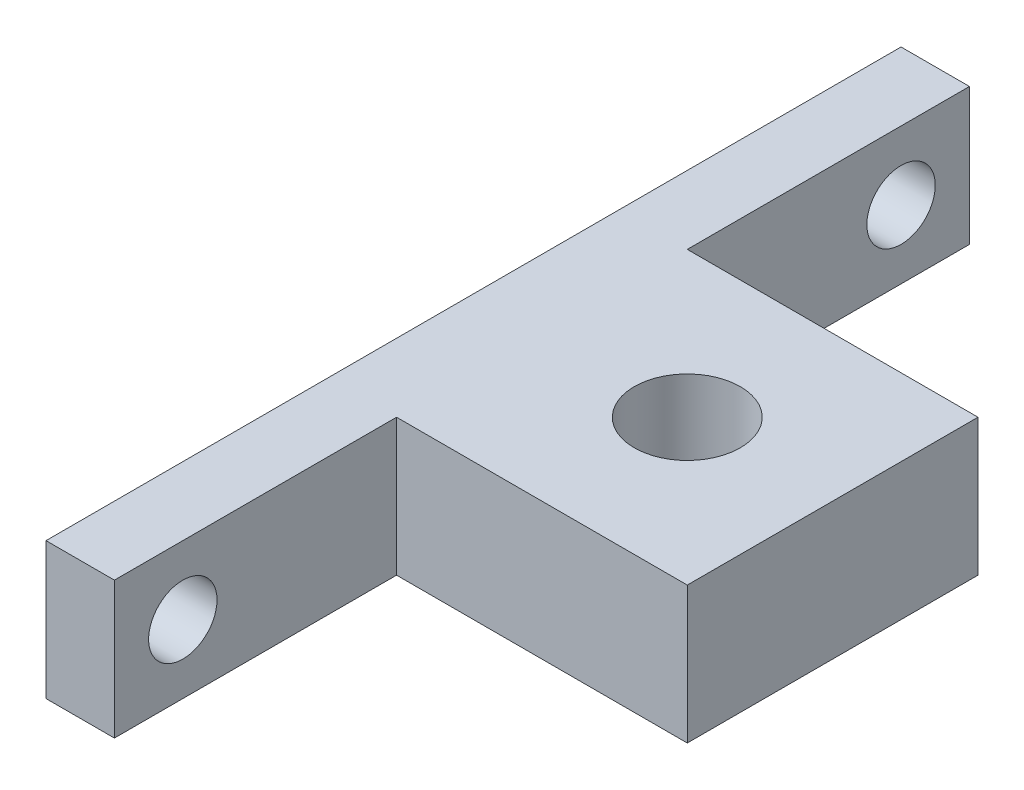
ISO-10303-21;
HEADER;
FILE_DESCRIPTION(('STEP AP214'),'2;1');
FILE_NAME('part.step','',(''),(''),'','','');
FILE_SCHEMA(('AUTOMOTIVE_DESIGN { 1 0 10303 214 1 1 1 1 }'));
ENDSEC;
DATA;
#1=APPLICATION_CONTEXT('core data for automotive mechanical design processes');
#2=APPLICATION_PROTOCOL_DEFINITION('international standard','automotive_design',2000,#1);
#3=PRODUCT_CONTEXT('',#1,'mechanical');
#4=PRODUCT('Part','Part','',(#3));
#5=PRODUCT_RELATED_PRODUCT_CATEGORY('part','',(#4));
#6=PRODUCT_DEFINITION_FORMATION('','',#4);
#7=PRODUCT_DEFINITION_CONTEXT('part definition',#1,'design');
#8=PRODUCT_DEFINITION('design','',#6,#7);
#9=PRODUCT_DEFINITION_SHAPE('','',#8);
#10=(LENGTH_UNIT() NAMED_UNIT(*) SI_UNIT(.MILLI.,.METRE.));
#11=(NAMED_UNIT(*) PLANE_ANGLE_UNIT() SI_UNIT($,.RADIAN.));
#12=(NAMED_UNIT(*) SI_UNIT($,.STERADIAN.) SOLID_ANGLE_UNIT());
#13=UNCERTAINTY_MEASURE_WITH_UNIT(LENGTH_MEASURE(1.E-05),#10,'distance_accuracy_value','');
#14=(GEOMETRIC_REPRESENTATION_CONTEXT(3) GLOBAL_UNCERTAINTY_ASSIGNED_CONTEXT((#13)) GLOBAL_UNIT_ASSIGNED_CONTEXT((#10,
#11,#12)) REPRESENTATION_CONTEXT('',''));
#15=CARTESIAN_POINT('',(0.,0.,0.));
#16=DIRECTION('',(0.,0.,1.));
#17=DIRECTION('',(1.,0.,0.));
#18=AXIS2_PLACEMENT_3D('',#15,#16,#17);
#19=CARTESIAN_POINT('',(4.,0.,0.));
#20=DIRECTION('',(-1.,0.,0.));
#21=DIRECTION('',(0.,0.,1.));
#22=AXIS2_PLACEMENT_3D('',#19,#20,#21);
#23=PLANE('',#22);
#24=CARTESIAN_POINT('',(4.,0.,21.));
#25=DIRECTION('',(1.,0.,0.));
#26=DIRECTION('',(0.,0.,-1.));
#27=AXIS2_PLACEMENT_3D('',#24,#25,#26);
#28=CIRCLE('',#27,2.);
#29=CARTESIAN_POINT('',(4.,0.,19.));
#30=VERTEX_POINT('',#29);
#31=EDGE_CURVE('E145',#30,#30,#28,.T.);
#32=ORIENTED_EDGE('',*,*,#31,.F.);
#33=EDGE_LOOP('',(#32));
#34=FACE_BOUND('',#33,.T.);
#35=DIRECTION('',(0.,-1.,0.));
#36=VECTOR('',#35,1.);
#37=CARTESIAN_POINT('',(4.,-4.00000000000001,8.5));
#38=LINE('',#37,#36);
#39=CARTESIAN_POINT('',(4.,4.,8.5));
#40=VERTEX_POINT('',#39);
#41=CARTESIAN_POINT('',(4.,-4.00000000000001,8.5));
#42=VERTEX_POINT('',#41);
#43=EDGE_CURVE('E128',#40,#42,#38,.T.);
#44=ORIENTED_EDGE('',*,*,#43,.F.);
#45=DIRECTION('',(0.,0.,1.));
#46=VECTOR('',#45,1.);
#47=CARTESIAN_POINT('',(4.,3.99999999999999,25.));
#48=LINE('',#47,#46);
#49=CARTESIAN_POINT('',(4.,3.99999999999999,25.));
#50=VERTEX_POINT('',#49);
#51=EDGE_CURVE('E157',#40,#50,#48,.T.);
#52=ORIENTED_EDGE('',*,*,#51,.T.);
#53=DIRECTION('',(0.,-1.,0.));
#54=VECTOR('',#53,1.);
#55=CARTESIAN_POINT('',(4.,-4.00000000000001,25.));
#56=LINE('',#55,#54);
#57=CARTESIAN_POINT('',(4.,-4.00000000000001,25.));
#58=VERTEX_POINT('',#57);
#59=EDGE_CURVE('E162',#50,#58,#56,.T.);
#60=ORIENTED_EDGE('',*,*,#59,.T.);
#61=DIRECTION('',(0.,0.,-1.));
#62=VECTOR('',#61,1.);
#63=CARTESIAN_POINT('',(4.,-4.00000000000001,25.));
#64=LINE('',#63,#62);
#65=EDGE_CURVE('E63',#58,#42,#64,.T.);
#66=ORIENTED_EDGE('',*,*,#65,.T.);
#67=EDGE_LOOP('',(#44,#52,#60,#66));
#68=FACE_BOUND('',#67,.T.);
#69=ADVANCED_FACE('F39',(#34,#68),#23,.F.);
#70=CARTESIAN_POINT('',(4.,0.,-21.));
#71=DIRECTION('',(1.,0.,0.));
#72=DIRECTION('',(0.,0.,1.));
#73=AXIS2_PLACEMENT_3D('',#70,#71,#72);
#74=CIRCLE('',#73,2.);
#75=CARTESIAN_POINT('',(4.,0.,-19.));
#76=VERTEX_POINT('',#75);
#77=EDGE_CURVE('E135',#76,#76,#74,.T.);
#78=ORIENTED_EDGE('',*,*,#77,.F.);
#79=EDGE_LOOP('',(#78));
#80=FACE_BOUND('',#79,.T.);
#81=DIRECTION('',(0.,1.,0.));
#82=VECTOR('',#81,1.);
#83=CARTESIAN_POINT('',(4.,-4.00000000000001,-8.5));
#84=LINE('',#83,#82);
#85=CARTESIAN_POINT('',(4.,-4.,-8.5));
#86=VERTEX_POINT('',#85);
#87=CARTESIAN_POINT('',(4.,4.00000000000001,-8.5));
#88=VERTEX_POINT('',#87);
#89=EDGE_CURVE('E55',#86,#88,#84,.T.);
#90=ORIENTED_EDGE('',*,*,#89,.F.);
#91=CARTESIAN_POINT('',(4.,-4.,-25.));
#92=VERTEX_POINT('',#91);
#93=EDGE_CURVE('E165',#86,#92,#64,.T.);
#94=ORIENTED_EDGE('',*,*,#93,.T.);
#95=DIRECTION('',(0.,1.,0.));
#96=VECTOR('',#95,1.);
#97=CARTESIAN_POINT('',(4.,-4.,-25.));
#98=LINE('',#97,#96);
#99=CARTESIAN_POINT('',(4.,4.00000000000001,-25.));
#100=VERTEX_POINT('',#99);
#101=EDGE_CURVE('E153',#92,#100,#98,.T.);
#102=ORIENTED_EDGE('',*,*,#101,.T.);
#103=EDGE_CURVE('E159',#100,#88,#48,.T.);
#104=ORIENTED_EDGE('',*,*,#103,.T.);
#105=EDGE_LOOP('',(#90,#94,#102,#104));
#106=FACE_BOUND('',#105,.T.);
#107=ADVANCED_FACE('F205',(#80,#106),#23,.F.);
#108=CARTESIAN_POINT('',(0.,0.,0.));
#109=DIRECTION('',(-1.,0.,0.));
#110=DIRECTION('',(0.,0.,1.));
#111=AXIS2_PLACEMENT_3D('',#108,#109,#110);
#112=PLANE('',#111);
#113=CARTESIAN_POINT('',(0.,0.,21.));
#114=DIRECTION('',(1.,0.,0.));
#115=DIRECTION('',(0.,0.,-1.));
#116=AXIS2_PLACEMENT_3D('',#113,#114,#115);
#117=CIRCLE('',#116,2.);
#118=CARTESIAN_POINT('',(0.,0.,19.));
#119=VERTEX_POINT('',#118);
#120=EDGE_CURVE('E143',#119,#119,#117,.T.);
#121=ORIENTED_EDGE('',*,*,#120,.T.);
#122=EDGE_LOOP('',(#121));
#123=FACE_BOUND('',#122,.T.);
#124=DIRECTION('',(0.,1.,0.));
#125=VECTOR('',#124,1.);
#126=CARTESIAN_POINT('',(0.,-4.,-25.));
#127=LINE('',#126,#125);
#128=CARTESIAN_POINT('',(0.,-4.,-25.));
#129=VERTEX_POINT('',#128);
#130=CARTESIAN_POINT('',(0.,4.00000000000001,-25.));
#131=VERTEX_POINT('',#130);
#132=EDGE_CURVE('E149',#129,#131,#127,.T.);
#133=ORIENTED_EDGE('',*,*,#132,.F.);
#134=DIRECTION('',(0.,0.,-1.));
#135=VECTOR('',#134,1.);
#136=CARTESIAN_POINT('',(0.,-4.00000000000001,25.));
#137=LINE('',#136,#135);
#138=CARTESIAN_POINT('',(0.,-4.00000000000001,25.));
#139=VERTEX_POINT('',#138);
#140=EDGE_CURVE('E158',#139,#129,#137,.T.);
#141=ORIENTED_EDGE('',*,*,#140,.F.);
#142=DIRECTION('',(0.,-1.,0.));
#143=VECTOR('',#142,1.);
#144=CARTESIAN_POINT('',(0.,-4.00000000000001,25.));
#145=LINE('',#144,#143);
#146=CARTESIAN_POINT('',(0.,3.99999999999999,25.));
#147=VERTEX_POINT('',#146);
#148=EDGE_CURVE('E175',#147,#139,#145,.T.);
#149=ORIENTED_EDGE('',*,*,#148,.F.);
#150=DIRECTION('',(0.,0.,1.));
#151=VECTOR('',#150,1.);
#152=CARTESIAN_POINT('',(0.,3.99999999999999,25.));
#153=LINE('',#152,#151);
#154=EDGE_CURVE('E172',#131,#147,#153,.T.);
#155=ORIENTED_EDGE('',*,*,#154,.F.);
#156=EDGE_LOOP('',(#133,#141,#149,#155));
#157=FACE_BOUND('',#156,.T.);
#158=CARTESIAN_POINT('',(0.,0.,-21.));
#159=DIRECTION('',(1.,0.,0.));
#160=DIRECTION('',(0.,0.,1.));
#161=AXIS2_PLACEMENT_3D('',#158,#159,#160);
#162=CIRCLE('',#161,2.);
#163=CARTESIAN_POINT('',(0.,0.,-19.));
#164=VERTEX_POINT('',#163);
#165=EDGE_CURVE('E130',#164,#164,#162,.T.);
#166=ORIENTED_EDGE('',*,*,#165,.T.);
#167=EDGE_LOOP('',(#166));
#168=FACE_BOUND('',#167,.T.);
#169=ADVANCED_FACE('F199',(#123,#157,#168),#112,.T.);
#170=CARTESIAN_POINT('',(4.,-4.,-25.));
#171=DIRECTION('',(0.,0.,1.));
#172=DIRECTION('',(1.,0.,0.));
#173=AXIS2_PLACEMENT_3D('',#170,#171,#172);
#174=PLANE('',#173);
#175=ORIENTED_EDGE('',*,*,#132,.T.);
#176=DIRECTION('',(-1.,0.,0.));
#177=VECTOR('',#176,1.);
#178=CARTESIAN_POINT('',(4.,4.00000000000001,-25.));
#179=LINE('',#178,#177);
#180=EDGE_CURVE('E11',#100,#131,#179,.T.);
#181=ORIENTED_EDGE('',*,*,#180,.F.);
#182=ORIENTED_EDGE('',*,*,#101,.F.);
#183=DIRECTION('',(-1.,0.,0.));
#184=VECTOR('',#183,1.);
#185=CARTESIAN_POINT('',(4.,-4.,-25.));
#186=LINE('',#185,#184);
#187=EDGE_CURVE('E168',#92,#129,#186,.T.);
#188=ORIENTED_EDGE('',*,*,#187,.T.);
#189=EDGE_LOOP('',(#175,#181,#182,#188));
#190=FACE_BOUND('',#189,.T.);
#191=ADVANCED_FACE('F41',(#190),#174,.F.);
#192=CARTESIAN_POINT('',(4.,3.99999999999999,25.));
#193=DIRECTION('',(0.,-1.,0.));
#194=DIRECTION('',(0.,0.,-1.));
#195=AXIS2_PLACEMENT_3D('',#192,#193,#194);
#196=PLANE('',#195);
#197=CARTESIAN_POINT('',(12.5,4.00000000000001,0.));
#198=DIRECTION('',(0.,-1.,0.));
#199=DIRECTION('',(0.,0.,-1.));
#200=AXIS2_PLACEMENT_3D('',#197,#198,#199);
#201=CIRCLE('',#200,3.1);
#202=CARTESIAN_POINT('',(12.5,4.00000000000001,-3.1));
#203=VERTEX_POINT('',#202);
#204=EDGE_CURVE('E220',#203,#203,#201,.T.);
#205=ORIENTED_EDGE('',*,*,#204,.T.);
#206=EDGE_LOOP('',(#205));
#207=FACE_BOUND('',#206,.T.);
#208=ORIENTED_EDGE('',*,*,#154,.T.);
#209=DIRECTION('',(-1.,0.,0.));
#210=VECTOR('',#209,1.);
#211=CARTESIAN_POINT('',(4.,3.99999999999999,25.));
#212=LINE('',#211,#210);
#213=EDGE_CURVE('E48',#50,#147,#212,.T.);
#214=ORIENTED_EDGE('',*,*,#213,.F.);
#215=ORIENTED_EDGE('',*,*,#51,.F.);
#216=DIRECTION('',(-1.,0.,0.));
#217=VECTOR('',#216,1.);
#218=CARTESIAN_POINT('',(21.,4.00000000000001,8.5));
#219=LINE('',#218,#217);
#220=CARTESIAN_POINT('',(21.,4.00000000000001,8.5));
#221=VERTEX_POINT('',#220);
#222=EDGE_CURVE('E209',#221,#40,#219,.T.);
#223=ORIENTED_EDGE('',*,*,#222,.F.);
#224=DIRECTION('',(0.,0.,1.));
#225=VECTOR('',#224,1.);
#226=CARTESIAN_POINT('',(21.,4.00000000000001,-8.5));
#227=LINE('',#226,#225);
#228=CARTESIAN_POINT('',(21.,4.00000000000001,-8.5));
#229=VERTEX_POINT('',#228);
#230=EDGE_CURVE('E121',#229,#221,#227,.T.);
#231=ORIENTED_EDGE('',*,*,#230,.F.);
#232=DIRECTION('',(-1.,0.,0.));
#233=VECTOR('',#232,1.);
#234=CARTESIAN_POINT('',(21.,4.00000000000001,-8.5));
#235=LINE('',#234,#233);
#236=EDGE_CURVE('E137',#229,#88,#235,.T.);
#237=ORIENTED_EDGE('',*,*,#236,.T.);
#238=ORIENTED_EDGE('',*,*,#103,.F.);
#239=ORIENTED_EDGE('',*,*,#180,.T.);
#240=EDGE_LOOP('',(#208,#214,#215,#223,#231,#237,#238,#239));
#241=FACE_BOUND('',#240,.T.);
#242=ADVANCED_FACE('F208',(#207,#241),#196,.F.);
#243=CARTESIAN_POINT('',(4.,-4.00000000000001,25.));
#244=DIRECTION('',(0.,0.,-1.));
#245=DIRECTION('',(-1.,0.,0.));
#246=AXIS2_PLACEMENT_3D('',#243,#244,#245);
#247=PLANE('',#246);
#248=ORIENTED_EDGE('',*,*,#148,.T.);
#249=DIRECTION('',(-1.,0.,0.));
#250=VECTOR('',#249,1.);
#251=CARTESIAN_POINT('',(4.,-4.00000000000001,25.));
#252=LINE('',#251,#250);
#253=EDGE_CURVE('E183',#58,#139,#252,.T.);
#254=ORIENTED_EDGE('',*,*,#253,.F.);
#255=ORIENTED_EDGE('',*,*,#59,.F.);
#256=ORIENTED_EDGE('',*,*,#213,.T.);
#257=EDGE_LOOP('',(#248,#254,#255,#256));
#258=FACE_BOUND('',#257,.T.);
#259=ADVANCED_FACE('F192',(#258),#247,.F.);
#260=CARTESIAN_POINT('',(4.,-4.00000000000001,25.));
#261=DIRECTION('',(0.,1.,0.));
#262=DIRECTION('',(0.,0.,1.));
#263=AXIS2_PLACEMENT_3D('',#260,#261,#262);
#264=PLANE('',#263);
#265=CARTESIAN_POINT('',(12.5,-4.00000000000001,0.));
#266=DIRECTION('',(0.,-1.,0.));
#267=DIRECTION('',(0.,0.,-1.));
#268=AXIS2_PLACEMENT_3D('',#265,#266,#267);
#269=CIRCLE('',#268,3.1);
#270=CARTESIAN_POINT('',(12.5,-4.00000000000001,-3.1));
#271=VERTEX_POINT('',#270);
#272=EDGE_CURVE('E224',#271,#271,#269,.T.);
#273=ORIENTED_EDGE('',*,*,#272,.F.);
#274=EDGE_LOOP('',(#273));
#275=FACE_BOUND('',#274,.T.);
#276=ORIENTED_EDGE('',*,*,#140,.T.);
#277=ORIENTED_EDGE('',*,*,#187,.F.);
#278=ORIENTED_EDGE('',*,*,#93,.F.);
#279=DIRECTION('',(-1.,0.,0.));
#280=VECTOR('',#279,1.);
#281=CARTESIAN_POINT('',(21.,-4.00000000000001,-8.5));
#282=LINE('',#281,#280);
#283=CARTESIAN_POINT('',(21.,-4.00000000000001,-8.5));
#284=VERTEX_POINT('',#283);
#285=EDGE_CURVE('E111',#284,#86,#282,.T.);
#286=ORIENTED_EDGE('',*,*,#285,.F.);
#287=DIRECTION('',(0.,0.,-1.));
#288=VECTOR('',#287,1.);
#289=CARTESIAN_POINT('',(21.,-4.00000000000001,-8.5));
#290=LINE('',#289,#288);
#291=CARTESIAN_POINT('',(21.,-4.00000000000001,8.5));
#292=VERTEX_POINT('',#291);
#293=EDGE_CURVE('E104',#292,#284,#290,.T.);
#294=ORIENTED_EDGE('',*,*,#293,.F.);
#295=DIRECTION('',(-1.,0.,0.));
#296=VECTOR('',#295,1.);
#297=CARTESIAN_POINT('',(21.,-4.00000000000001,8.5));
#298=LINE('',#297,#296);
#299=EDGE_CURVE('E108',#292,#42,#298,.T.);
#300=ORIENTED_EDGE('',*,*,#299,.T.);
#301=ORIENTED_EDGE('',*,*,#65,.F.);
#302=ORIENTED_EDGE('',*,*,#253,.T.);
#303=EDGE_LOOP('',(#276,#277,#278,#286,#294,#300,#301,#302));
#304=FACE_BOUND('',#303,.T.);
#305=ADVANCED_FACE('F106',(#275,#304),#264,.F.);
#306=CARTESIAN_POINT('',(4.,0.,21.));
#307=DIRECTION('',(-1.,0.,0.));
#308=DIRECTION('',(0.,0.,1.));
#309=AXIS2_PLACEMENT_3D('',#306,#307,#308);
#310=CYLINDRICAL_SURFACE('',#309,2.);
#311=ORIENTED_EDGE('',*,*,#31,.T.);
#312=EDGE_LOOP('',(#311));
#313=FACE_BOUND('',#312,.T.);
#314=ORIENTED_EDGE('',*,*,#120,.F.);
#315=EDGE_LOOP('',(#314));
#316=FACE_BOUND('',#315,.T.);
#317=ADVANCED_FACE('F240',(#313,#316),#310,.F.);
#318=CARTESIAN_POINT('',(4.,0.,-21.));
#319=DIRECTION('',(-1.,0.,0.));
#320=DIRECTION('',(0.,0.,1.));
#321=AXIS2_PLACEMENT_3D('',#318,#319,#320);
#322=CYLINDRICAL_SURFACE('',#321,2.);
#323=ORIENTED_EDGE('',*,*,#77,.T.);
#324=EDGE_LOOP('',(#323));
#325=FACE_BOUND('',#324,.T.);
#326=ORIENTED_EDGE('',*,*,#165,.F.);
#327=EDGE_LOOP('',(#326));
#328=FACE_BOUND('',#327,.T.);
#329=ADVANCED_FACE('F247',(#325,#328),#322,.F.);
#330=CARTESIAN_POINT('',(21.,-4.00000000000001,8.5));
#331=DIRECTION('',(0.,0.,-1.));
#332=DIRECTION('',(-1.,0.,0.));
#333=AXIS2_PLACEMENT_3D('',#330,#331,#332);
#334=PLANE('',#333);
#335=ORIENTED_EDGE('',*,*,#43,.T.);
#336=ORIENTED_EDGE('',*,*,#299,.F.);
#337=DIRECTION('',(0.,-1.,0.));
#338=VECTOR('',#337,1.);
#339=CARTESIAN_POINT('',(21.,-4.00000000000001,8.5));
#340=LINE('',#339,#338);
#341=EDGE_CURVE('E116',#221,#292,#340,.T.);
#342=ORIENTED_EDGE('',*,*,#341,.F.);
#343=ORIENTED_EDGE('',*,*,#222,.T.);
#344=EDGE_LOOP('',(#335,#336,#342,#343));
#345=FACE_BOUND('',#344,.T.);
#346=ADVANCED_FACE('F127',(#345),#334,.F.);
#347=CARTESIAN_POINT('',(21.,-4.00000000000001,-8.5));
#348=DIRECTION('',(0.,0.,1.));
#349=DIRECTION('',(1.,0.,0.));
#350=AXIS2_PLACEMENT_3D('',#347,#348,#349);
#351=PLANE('',#350);
#352=ORIENTED_EDGE('',*,*,#89,.T.);
#353=ORIENTED_EDGE('',*,*,#236,.F.);
#354=DIRECTION('',(0.,1.,0.));
#355=VECTOR('',#354,1.);
#356=CARTESIAN_POINT('',(21.,-4.00000000000001,-8.5));
#357=LINE('',#356,#355);
#358=EDGE_CURVE('E115',#284,#229,#357,.T.);
#359=ORIENTED_EDGE('',*,*,#358,.F.);
#360=ORIENTED_EDGE('',*,*,#285,.T.);
#361=EDGE_LOOP('',(#352,#353,#359,#360));
#362=FACE_BOUND('',#361,.T.);
#363=ADVANCED_FACE('F327',(#362),#351,.F.);
#364=CARTESIAN_POINT('',(21.,0.,0.));
#365=DIRECTION('',(1.,0.,0.));
#366=DIRECTION('',(0.,0.,-1.));
#367=AXIS2_PLACEMENT_3D('',#364,#365,#366);
#368=PLANE('',#367);
#369=ORIENTED_EDGE('',*,*,#341,.T.);
#370=ORIENTED_EDGE('',*,*,#293,.T.);
#371=ORIENTED_EDGE('',*,*,#358,.T.);
#372=ORIENTED_EDGE('',*,*,#230,.T.);
#373=EDGE_LOOP('',(#369,#370,#371,#372));
#374=FACE_BOUND('',#373,.T.);
#375=ADVANCED_FACE('F119',(#374),#368,.T.);
#376=CARTESIAN_POINT('',(12.5,4.00000000000001,0.));
#377=DIRECTION('',(0.,-1.,0.));
#378=DIRECTION('',(0.,0.,-1.));
#379=AXIS2_PLACEMENT_3D('',#376,#377,#378);
#380=CYLINDRICAL_SURFACE('',#379,3.1);
#381=ORIENTED_EDGE('',*,*,#204,.F.);
#382=EDGE_LOOP('',(#381));
#383=FACE_BOUND('',#382,.T.);
#384=ORIENTED_EDGE('',*,*,#272,.T.);
#385=EDGE_LOOP('',(#384));
#386=FACE_BOUND('',#385,.T.);
#387=ADVANCED_FACE('F233',(#383,#386),#380,.F.);
#388=CLOSED_SHELL('',(#69,#107,#169,#191,#242,#259,#305,#317,#329,#346,#363,#375,#387));
#389=MANIFOLD_SOLID_BREP('B2',#388);
#390=ADVANCED_BREP_SHAPE_REPRESENTATION('',(#18,#389),#14);
#391=SHAPE_DEFINITION_REPRESENTATION(#9,#390);
ENDSEC;
END-ISO-10303-21;
